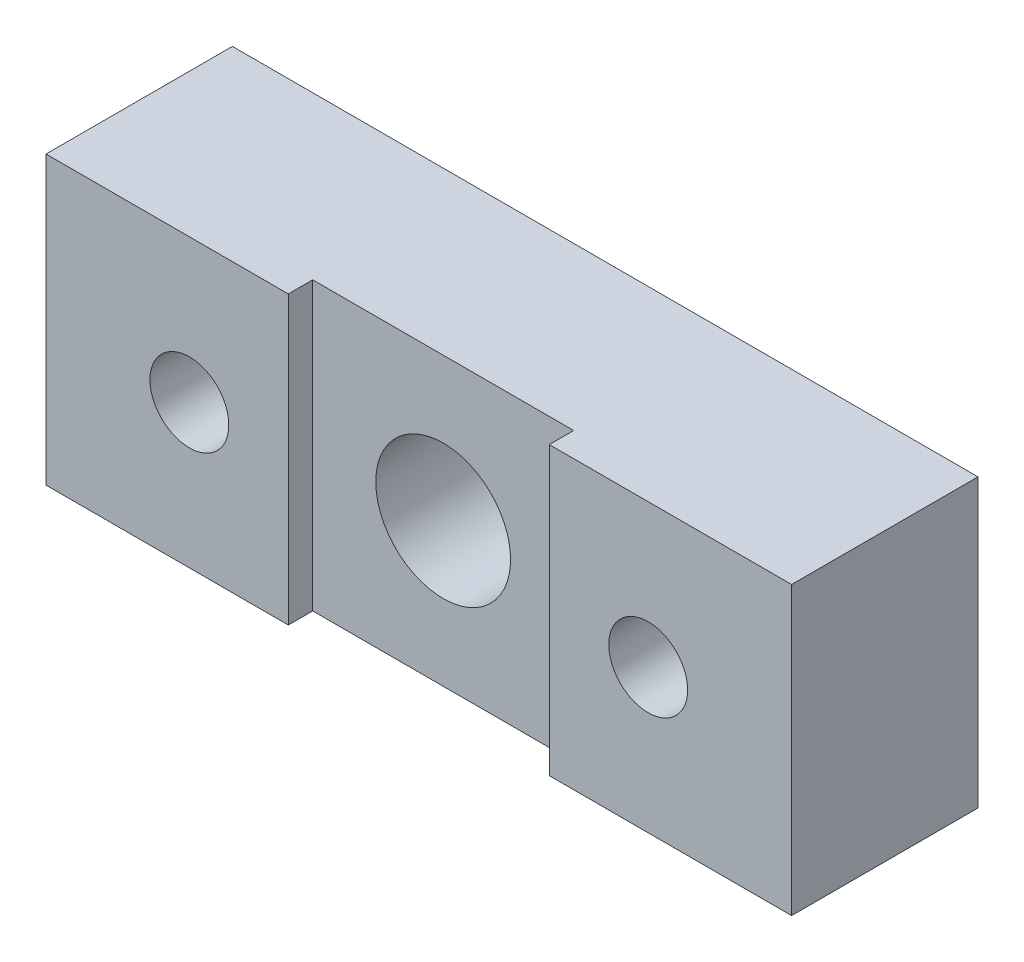
ISO-10303-21;
HEADER;
FILE_DESCRIPTION(('STEP AP214'),'2;1');
FILE_NAME('part.step','',(''),(''),'','','');
FILE_SCHEMA(('AUTOMOTIVE_DESIGN { 1 0 10303 214 1 1 1 1 }'));
ENDSEC;
DATA;
#1=APPLICATION_CONTEXT('core data for automotive mechanical design processes');
#2=APPLICATION_PROTOCOL_DEFINITION('international standard','automotive_design',2000,#1);
#3=PRODUCT_CONTEXT('',#1,'mechanical');
#4=PRODUCT('Part','Part','',(#3));
#5=PRODUCT_RELATED_PRODUCT_CATEGORY('part','',(#4));
#6=PRODUCT_DEFINITION_FORMATION('','',#4);
#7=PRODUCT_DEFINITION_CONTEXT('part definition',#1,'design');
#8=PRODUCT_DEFINITION('design','',#6,#7);
#9=PRODUCT_DEFINITION_SHAPE('','',#8);
#10=(LENGTH_UNIT() NAMED_UNIT(*) SI_UNIT(.MILLI.,.METRE.));
#11=(NAMED_UNIT(*) PLANE_ANGLE_UNIT() SI_UNIT($,.RADIAN.));
#12=(NAMED_UNIT(*) SI_UNIT($,.STERADIAN.) SOLID_ANGLE_UNIT());
#13=UNCERTAINTY_MEASURE_WITH_UNIT(LENGTH_MEASURE(1.E-05),#10,'distance_accuracy_value','');
#14=(GEOMETRIC_REPRESENTATION_CONTEXT(3) GLOBAL_UNCERTAINTY_ASSIGNED_CONTEXT((#13)) GLOBAL_UNIT_ASSIGNED_CONTEXT((#10,
#11,#12)) REPRESENTATION_CONTEXT('',''));
#15=CARTESIAN_POINT('',(0.,0.,0.));
#16=DIRECTION('',(0.,0.,1.));
#17=DIRECTION('',(1.,0.,0.));
#18=AXIS2_PLACEMENT_3D('',#15,#16,#17);
#19=CARTESIAN_POINT('',(0.,0.,13.));
#20=DIRECTION('',(0.,0.,1.));
#21=DIRECTION('',(1.,0.,0.));
#22=AXIS2_PLACEMENT_3D('',#19,#20,#21);
#23=PLANE('',#22);
#24=DIRECTION('',(0.,-1.,0.));
#25=VECTOR('',#24,1.);
#26=CARTESIAN_POINT('',(-9.1,-10.,13.));
#27=LINE('',#26,#25);
#28=CARTESIAN_POINT('',(-9.1,10.,13.));
#29=VERTEX_POINT('',#28);
#30=CARTESIAN_POINT('',(-9.1,-10.,13.));
#31=VERTEX_POINT('',#30);
#32=EDGE_CURVE('E232',#29,#31,#27,.T.);
#33=ORIENTED_EDGE('',*,*,#32,.F.);
#34=DIRECTION('',(-1.,0.,0.));
#35=VECTOR('',#34,1.);
#36=CARTESIAN_POINT('',(-26.,10.,13.));
#37=LINE('',#36,#35);
#38=CARTESIAN_POINT('',(-26.,10.,13.));
#39=VERTEX_POINT('',#38);
#40=EDGE_CURVE('E159',#29,#39,#37,.T.);
#41=ORIENTED_EDGE('',*,*,#40,.T.);
#42=DIRECTION('',(0.,-1.,0.));
#43=VECTOR('',#42,1.);
#44=CARTESIAN_POINT('',(-26.,10.,13.));
#45=LINE('',#44,#43);
#46=CARTESIAN_POINT('',(-26.,-10.,13.));
#47=VERTEX_POINT('',#46);
#48=EDGE_CURVE('E161',#39,#47,#45,.T.);
#49=ORIENTED_EDGE('',*,*,#48,.T.);
#50=DIRECTION('',(1.,0.,0.));
#51=VECTOR('',#50,1.);
#52=CARTESIAN_POINT('',(-26.,-10.,13.));
#53=LINE('',#52,#51);
#54=EDGE_CURVE('E163',#47,#31,#53,.T.);
#55=ORIENTED_EDGE('',*,*,#54,.T.);
#56=EDGE_LOOP('',(#33,#41,#49,#55));
#57=FACE_BOUND('',#56,.T.);
#58=CARTESIAN_POINT('',(-16.,0.,13.));
#59=DIRECTION('',(0.,0.,1.));
#60=DIRECTION('',(1.,0.,0.));
#61=AXIS2_PLACEMENT_3D('',#58,#59,#60);
#62=CIRCLE('',#61,2.75);
#63=CARTESIAN_POINT('',(-18.75,0.,13.));
#64=VERTEX_POINT('',#63);
#65=EDGE_CURVE('E153',#64,#64,#62,.T.);
#66=ORIENTED_EDGE('',*,*,#65,.F.);
#67=EDGE_LOOP('',(#66));
#68=FACE_BOUND('',#67,.T.);
#69=ADVANCED_FACE('F36',(#57,#68),#23,.T.);
#70=CARTESIAN_POINT('',(0.,0.,13.));
#71=DIRECTION('',(0.,0.,-1.));
#72=DIRECTION('',(-1.,0.,0.));
#73=AXIS2_PLACEMENT_3D('',#70,#71,#72);
#74=CYLINDRICAL_SURFACE('',#73,4.7);
#75=CARTESIAN_POINT('',(0.,0.,0.));
#76=DIRECTION('',(0.,0.,1.));
#77=DIRECTION('',(1.,0.,0.));
#78=AXIS2_PLACEMENT_3D('',#75,#76,#77);
#79=CIRCLE('',#78,4.7);
#80=CARTESIAN_POINT('',(-4.7,0.,0.));
#81=VERTEX_POINT('',#80);
#82=EDGE_CURVE('E145',#81,#81,#79,.T.);
#83=CARTESIAN_POINT('',(0.,0.,11.3));
#84=DIRECTION('',(0.,0.,1.));
#85=DIRECTION('',(1.,0.,0.));
#86=AXIS2_PLACEMENT_3D('',#83,#84,#85);
#87=CIRCLE('',#86,4.7);
#88=CARTESIAN_POINT('',(-4.7,0.,11.3));
#89=VERTEX_POINT('',#88);
#90=EDGE_CURVE('E141',#89,#89,#87,.T.);
#91=CARTESIAN_POINT('',(-4.7,0.,0.));
#92=CARTESIAN_POINT('',(-4.7,0.,0.117708333333333));
#93=CARTESIAN_POINT('',(-4.7,0.,0.235416666666666));
#94=CARTESIAN_POINT('',(-4.7,0.,0.470833333333333));
#95=CARTESIAN_POINT('',(-4.7,0.,0.588541666666667));
#96=CARTESIAN_POINT('',(-4.7,0.,0.823958333333333));
#97=CARTESIAN_POINT('',(-4.7,0.,0.941666666666667));
#98=CARTESIAN_POINT('',(-4.7,0.,1.17708333333333));
#99=CARTESIAN_POINT('',(-4.7,0.,1.29479166666667));
#100=CARTESIAN_POINT('',(-4.7,0.,1.53020833333333));
#101=CARTESIAN_POINT('',(-4.7,0.,1.64791666666667));
#102=CARTESIAN_POINT('',(-4.7,0.,1.88333333333333));
#103=CARTESIAN_POINT('',(-4.7,0.,2.00104166666667));
#104=CARTESIAN_POINT('',(-4.7,0.,2.23645833333333));
#105=CARTESIAN_POINT('',(-4.7,0.,2.35416666666667));
#106=CARTESIAN_POINT('',(-4.7,0.,2.58958333333333));
#107=CARTESIAN_POINT('',(-4.7,0.,2.70729166666667));
#108=CARTESIAN_POINT('',(-4.7,0.,2.94270833333333));
#109=CARTESIAN_POINT('',(-4.7,0.,3.06041666666667));
#110=CARTESIAN_POINT('',(-4.7,0.,3.29583333333333));
#111=CARTESIAN_POINT('',(-4.7,0.,3.41354166666667));
#112=CARTESIAN_POINT('',(-4.7,0.,3.64895833333333));
#113=CARTESIAN_POINT('',(-4.7,0.,3.76666666666667));
#114=CARTESIAN_POINT('',(-4.7,0.,4.00208333333333));
#115=CARTESIAN_POINT('',(-4.7,0.,4.11979166666667));
#116=CARTESIAN_POINT('',(-4.7,0.,4.35520833333333));
#117=CARTESIAN_POINT('',(-4.7,0.,4.47291666666667));
#118=CARTESIAN_POINT('',(-4.7,0.,4.70833333333333));
#119=CARTESIAN_POINT('',(-4.7,0.,4.82604166666667));
#120=CARTESIAN_POINT('',(-4.7,0.,5.06145833333333));
#121=CARTESIAN_POINT('',(-4.7,0.,5.17916666666667));
#122=CARTESIAN_POINT('',(-4.7,0.,5.41458333333333));
#123=CARTESIAN_POINT('',(-4.7,0.,5.53229166666667));
#124=CARTESIAN_POINT('',(-4.7,0.,5.76770833333333));
#125=CARTESIAN_POINT('',(-4.7,0.,5.88541666666667));
#126=CARTESIAN_POINT('',(-4.7,0.,6.12083333333333));
#127=CARTESIAN_POINT('',(-4.7,0.,6.23854166666667));
#128=CARTESIAN_POINT('',(-4.7,0.,6.47395833333333));
#129=CARTESIAN_POINT('',(-4.7,0.,6.59166666666667));
#130=CARTESIAN_POINT('',(-4.7,0.,6.82708333333333));
#131=CARTESIAN_POINT('',(-4.7,0.,6.94479166666667));
#132=CARTESIAN_POINT('',(-4.7,0.,7.18020833333333));
#133=CARTESIAN_POINT('',(-4.7,0.,7.29791666666667));
#134=CARTESIAN_POINT('',(-4.7,0.,7.53333333333333));
#135=CARTESIAN_POINT('',(-4.7,0.,7.65104166666667));
#136=CARTESIAN_POINT('',(-4.7,0.,7.88645833333333));
#137=CARTESIAN_POINT('',(-4.7,0.,8.00416666666667));
#138=CARTESIAN_POINT('',(-4.7,0.,8.23958333333333));
#139=CARTESIAN_POINT('',(-4.7,0.,8.35729166666667));
#140=CARTESIAN_POINT('',(-4.7,0.,8.59270833333333));
#141=CARTESIAN_POINT('',(-4.7,0.,8.71041666666667));
#142=CARTESIAN_POINT('',(-4.7,0.,8.94583333333333));
#143=CARTESIAN_POINT('',(-4.7,0.,9.06354166666667));
#144=CARTESIAN_POINT('',(-4.7,0.,9.29895833333333));
#145=CARTESIAN_POINT('',(-4.7,0.,9.41666666666667));
#146=CARTESIAN_POINT('',(-4.7,0.,9.65208333333333));
#147=CARTESIAN_POINT('',(-4.7,0.,9.76979166666667));
#148=CARTESIAN_POINT('',(-4.7,0.,10.0052083333333));
#149=CARTESIAN_POINT('',(-4.7,0.,10.1229166666667));
#150=CARTESIAN_POINT('',(-4.7,0.,10.3583333333333));
#151=CARTESIAN_POINT('',(-4.7,0.,10.4760416666667));
#152=CARTESIAN_POINT('',(-4.7,0.,10.7114583333333));
#153=CARTESIAN_POINT('',(-4.7,0.,10.8291666666667));
#154=CARTESIAN_POINT('',(-4.7,0.,11.0645833333333));
#155=CARTESIAN_POINT('',(-4.7,0.,11.1822916666667));
#156=CARTESIAN_POINT('',(-4.7,0.,11.3));
#157=B_SPLINE_CURVE_WITH_KNOTS('',3,(#91,#92,#93,#94,#95,#96,#97,#98,#99,#100,#101,#102,#103,
#104,#105,#106,#107,#108,#109,#110,#111,#112,#113,#114,#115,#116,#117,#118,#119,#120,#121,#122,
#123,#124,#125,#126,#127,#128,#129,#130,#131,#132,#133,#134,#135,#136,#137,#138,#139,#140,#141,
#142,#143,#144,#145,#146,#147,#148,#149,#150,#151,#152,#153,#154,#155,#156),.UNSPECIFIED.,.F.,
.F.,(4,2,2,2,2,2,2,2,2,2,2,2,2,2,2,2,2,2,2,2,2,2,2,2,2,2,2,2,2,2,2,2,4),(0.,0.353124999999999,
0.70625,1.059375,1.4125,1.765625,2.11875,2.471875,2.825,3.178125,3.53125,3.884375,4.2375,
4.590625,4.94375,5.296875,5.65,6.003125,6.35625,6.709375,7.0625,7.415625,7.76875,8.121875,8.475,
8.828125,9.18125,9.534375,9.8875,10.240625,10.59375,10.946875,11.3),.UNSPECIFIED.);
#158=EDGE_CURVE('BSEAM204',#81,#89,#157,.T.);
#159=ORIENTED_EDGE('',*,*,#82,.F.);
#160=ORIENTED_EDGE('',*,*,#90,.T.);
#161=ORIENTED_EDGE('',*,*,#158,.T.);
#162=ORIENTED_EDGE('',*,*,#158,.F.);
#163=EDGE_LOOP('',(#159,#161,#160,#162));
#164=FACE_BOUND('',#163,.T.);
#165=ADVANCED_FACE('F204',(#164),#74,.F.);
#166=CARTESIAN_POINT('',(-16.,0.,13.));
#167=DIRECTION('',(0.,0.,-1.));
#168=DIRECTION('',(-1.,0.,0.));
#169=AXIS2_PLACEMENT_3D('',#166,#167,#168);
#170=CYLINDRICAL_SURFACE('',#169,2.75);
#171=CARTESIAN_POINT('',(-16.,0.,6.));
#172=DIRECTION('',(0.,0.,-1.));
#173=DIRECTION('',(-1.,0.,0.));
#174=AXIS2_PLACEMENT_3D('',#171,#172,#173);
#175=CIRCLE('',#174,2.75);
#176=CARTESIAN_POINT('',(-18.75,0.,6.));
#177=VERTEX_POINT('',#176);
#178=EDGE_CURVE('E44',#177,#177,#175,.T.);
#179=CARTESIAN_POINT('',(-18.75,0.,6.));
#180=CARTESIAN_POINT('',(-18.75,0.,6.07291666666667));
#181=CARTESIAN_POINT('',(-18.75,0.,6.14583333333333));
#182=CARTESIAN_POINT('',(-18.75,0.,6.29166666666667));
#183=CARTESIAN_POINT('',(-18.75,0.,6.36458333333333));
#184=CARTESIAN_POINT('',(-18.75,0.,6.51041666666667));
#185=CARTESIAN_POINT('',(-18.75,0.,6.58333333333333));
#186=CARTESIAN_POINT('',(-18.75,0.,6.72916666666667));
#187=CARTESIAN_POINT('',(-18.75,0.,6.80208333333333));
#188=CARTESIAN_POINT('',(-18.75,0.,6.94791666666667));
#189=CARTESIAN_POINT('',(-18.75,0.,7.02083333333333));
#190=CARTESIAN_POINT('',(-18.75,0.,7.16666666666667));
#191=CARTESIAN_POINT('',(-18.75,0.,7.23958333333333));
#192=CARTESIAN_POINT('',(-18.75,0.,7.38541666666667));
#193=CARTESIAN_POINT('',(-18.75,0.,7.45833333333333));
#194=CARTESIAN_POINT('',(-18.75,0.,7.60416666666667));
#195=CARTESIAN_POINT('',(-18.75,0.,7.67708333333333));
#196=CARTESIAN_POINT('',(-18.75,0.,7.82291666666667));
#197=CARTESIAN_POINT('',(-18.75,0.,7.89583333333333));
#198=CARTESIAN_POINT('',(-18.75,0.,8.04166666666667));
#199=CARTESIAN_POINT('',(-18.75,0.,8.11458333333333));
#200=CARTESIAN_POINT('',(-18.75,0.,8.26041666666667));
#201=CARTESIAN_POINT('',(-18.75,0.,8.33333333333333));
#202=CARTESIAN_POINT('',(-18.75,0.,8.47916666666667));
#203=CARTESIAN_POINT('',(-18.75,0.,8.55208333333333));
#204=CARTESIAN_POINT('',(-18.75,0.,8.69791666666667));
#205=CARTESIAN_POINT('',(-18.75,0.,8.77083333333333));
#206=CARTESIAN_POINT('',(-18.75,0.,8.91666666666667));
#207=CARTESIAN_POINT('',(-18.75,0.,8.98958333333333));
#208=CARTESIAN_POINT('',(-18.75,0.,9.13541666666667));
#209=CARTESIAN_POINT('',(-18.75,0.,9.20833333333333));
#210=CARTESIAN_POINT('',(-18.75,0.,9.35416666666667));
#211=CARTESIAN_POINT('',(-18.75,0.,9.42708333333333));
#212=CARTESIAN_POINT('',(-18.75,0.,9.57291666666667));
#213=CARTESIAN_POINT('',(-18.75,0.,9.64583333333333));
#214=CARTESIAN_POINT('',(-18.75,0.,9.79166666666667));
#215=CARTESIAN_POINT('',(-18.75,0.,9.86458333333333));
#216=CARTESIAN_POINT('',(-18.75,0.,10.0104166666667));
#217=CARTESIAN_POINT('',(-18.75,0.,10.0833333333333));
#218=CARTESIAN_POINT('',(-18.75,0.,10.2291666666667));
#219=CARTESIAN_POINT('',(-18.75,0.,10.3020833333333));
#220=CARTESIAN_POINT('',(-18.75,0.,10.4479166666667));
#221=CARTESIAN_POINT('',(-18.75,0.,10.5208333333333));
#222=CARTESIAN_POINT('',(-18.75,0.,10.6666666666667));
#223=CARTESIAN_POINT('',(-18.75,0.,10.7395833333333));
#224=CARTESIAN_POINT('',(-18.75,0.,10.8854166666667));
#225=CARTESIAN_POINT('',(-18.75,0.,10.9583333333333));
#226=CARTESIAN_POINT('',(-18.75,0.,11.1041666666667));
#227=CARTESIAN_POINT('',(-18.75,0.,11.1770833333333));
#228=CARTESIAN_POINT('',(-18.75,0.,11.3229166666667));
#229=CARTESIAN_POINT('',(-18.75,0.,11.3958333333333));
#230=CARTESIAN_POINT('',(-18.75,0.,11.5416666666667));
#231=CARTESIAN_POINT('',(-18.75,0.,11.6145833333333));
#232=CARTESIAN_POINT('',(-18.75,0.,11.7604166666667));
#233=CARTESIAN_POINT('',(-18.75,0.,11.8333333333333));
#234=CARTESIAN_POINT('',(-18.75,0.,11.9791666666667));
#235=CARTESIAN_POINT('',(-18.75,0.,12.0520833333333));
#236=CARTESIAN_POINT('',(-18.75,0.,12.1979166666667));
#237=CARTESIAN_POINT('',(-18.75,0.,12.2708333333333));
#238=CARTESIAN_POINT('',(-18.75,0.,12.4166666666667));
#239=CARTESIAN_POINT('',(-18.75,0.,12.4895833333333));
#240=CARTESIAN_POINT('',(-18.75,0.,12.6354166666667));
#241=CARTESIAN_POINT('',(-18.75,0.,12.7083333333333));
#242=CARTESIAN_POINT('',(-18.75,0.,12.8541666666667));
#243=CARTESIAN_POINT('',(-18.75,0.,12.9270833333333));
#244=CARTESIAN_POINT('',(-18.75,0.,13.));
#245=B_SPLINE_CURVE_WITH_KNOTS('',3,(#179,#180,#181,#182,#183,#184,#185,#186,#187,#188,#189,
#190,#191,#192,#193,#194,#195,#196,#197,#198,#199,#200,#201,#202,#203,#204,#205,#206,#207,#208,
#209,#210,#211,#212,#213,#214,#215,#216,#217,#218,#219,#220,#221,#222,#223,#224,#225,#226,#227,
#228,#229,#230,#231,#232,#233,#234,#235,#236,#237,#238,#239,#240,#241,#242,#243,#244),
.UNSPECIFIED.,.F.,.F.,(4,2,2,2,2,2,2,2,2,2,2,2,2,2,2,2,2,2,2,2,2,2,2,2,2,2,2,2,2,2,2,2,4),(0.,
0.21875,0.4375,0.65625,0.875,1.09375,1.3125,1.53125,1.75,1.96875,2.1875,2.40625,2.625,2.84375,
3.0625,3.28125,3.5,3.71875,3.9375,4.15625,4.375,4.59375,4.8125,5.03125,5.25,5.46875,5.6875,
5.90625,6.125,6.34375,6.5625,6.78125,7.),.UNSPECIFIED.);
#246=EDGE_CURVE('BSEAM192',#177,#64,#245,.T.);
#247=ORIENTED_EDGE('',*,*,#178,.T.);
#248=ORIENTED_EDGE('',*,*,#65,.T.);
#249=ORIENTED_EDGE('',*,*,#246,.T.);
#250=ORIENTED_EDGE('',*,*,#246,.F.);
#251=EDGE_LOOP('',(#247,#249,#248,#250));
#252=FACE_BOUND('',#251,.T.);
#253=ADVANCED_FACE('F192',(#252),#170,.F.);
#254=CARTESIAN_POINT('',(16.,0.,13.));
#255=DIRECTION('',(0.,0.,-1.));
#256=DIRECTION('',(-1.,0.,0.));
#257=AXIS2_PLACEMENT_3D('',#254,#255,#256);
#258=CYLINDRICAL_SURFACE('',#257,2.75);
#259=CARTESIAN_POINT('',(16.,0.,6.));
#260=DIRECTION('',(0.,0.,-1.));
#261=DIRECTION('',(-1.,0.,0.));
#262=AXIS2_PLACEMENT_3D('',#259,#260,#261);
#263=CIRCLE('',#262,2.75);
#264=CARTESIAN_POINT('',(13.25,0.,6.));
#265=VERTEX_POINT('',#264);
#266=EDGE_CURVE('E182',#265,#265,#263,.T.);
#267=CARTESIAN_POINT('',(16.,0.,13.));
#268=DIRECTION('',(0.,0.,1.));
#269=DIRECTION('',(1.,0.,0.));
#270=AXIS2_PLACEMENT_3D('',#267,#268,#269);
#271=CIRCLE('',#270,2.75);
#272=CARTESIAN_POINT('',(13.25,0.,13.));
#273=VERTEX_POINT('',#272);
#274=EDGE_CURVE('E150',#273,#273,#271,.T.);
#275=CARTESIAN_POINT('',(13.25,0.,6.));
#276=CARTESIAN_POINT('',(13.25,0.,6.07291666666667));
#277=CARTESIAN_POINT('',(13.25,0.,6.14583333333333));
#278=CARTESIAN_POINT('',(13.25,0.,6.29166666666667));
#279=CARTESIAN_POINT('',(13.25,0.,6.36458333333333));
#280=CARTESIAN_POINT('',(13.25,0.,6.51041666666667));
#281=CARTESIAN_POINT('',(13.25,0.,6.58333333333333));
#282=CARTESIAN_POINT('',(13.25,0.,6.72916666666667));
#283=CARTESIAN_POINT('',(13.25,0.,6.80208333333333));
#284=CARTESIAN_POINT('',(13.25,0.,6.94791666666667));
#285=CARTESIAN_POINT('',(13.25,0.,7.02083333333333));
#286=CARTESIAN_POINT('',(13.25,0.,7.16666666666667));
#287=CARTESIAN_POINT('',(13.25,0.,7.23958333333333));
#288=CARTESIAN_POINT('',(13.25,0.,7.38541666666667));
#289=CARTESIAN_POINT('',(13.25,0.,7.45833333333333));
#290=CARTESIAN_POINT('',(13.25,0.,7.60416666666667));
#291=CARTESIAN_POINT('',(13.25,0.,7.67708333333333));
#292=CARTESIAN_POINT('',(13.25,0.,7.82291666666667));
#293=CARTESIAN_POINT('',(13.25,0.,7.89583333333333));
#294=CARTESIAN_POINT('',(13.25,0.,8.04166666666667));
#295=CARTESIAN_POINT('',(13.25,0.,8.11458333333333));
#296=CARTESIAN_POINT('',(13.25,0.,8.26041666666667));
#297=CARTESIAN_POINT('',(13.25,0.,8.33333333333333));
#298=CARTESIAN_POINT('',(13.25,0.,8.47916666666667));
#299=CARTESIAN_POINT('',(13.25,0.,8.55208333333333));
#300=CARTESIAN_POINT('',(13.25,0.,8.69791666666667));
#301=CARTESIAN_POINT('',(13.25,0.,8.77083333333333));
#302=CARTESIAN_POINT('',(13.25,0.,8.91666666666667));
#303=CARTESIAN_POINT('',(13.25,0.,8.98958333333333));
#304=CARTESIAN_POINT('',(13.25,0.,9.13541666666667));
#305=CARTESIAN_POINT('',(13.25,0.,9.20833333333333));
#306=CARTESIAN_POINT('',(13.25,0.,9.35416666666667));
#307=CARTESIAN_POINT('',(13.25,0.,9.42708333333333));
#308=CARTESIAN_POINT('',(13.25,0.,9.57291666666667));
#309=CARTESIAN_POINT('',(13.25,0.,9.64583333333333));
#310=CARTESIAN_POINT('',(13.25,0.,9.79166666666667));
#311=CARTESIAN_POINT('',(13.25,0.,9.86458333333333));
#312=CARTESIAN_POINT('',(13.25,0.,10.0104166666667));
#313=CARTESIAN_POINT('',(13.25,0.,10.0833333333333));
#314=CARTESIAN_POINT('',(13.25,0.,10.2291666666667));
#315=CARTESIAN_POINT('',(13.25,0.,10.3020833333333));
#316=CARTESIAN_POINT('',(13.25,0.,10.4479166666667));
#317=CARTESIAN_POINT('',(13.25,0.,10.5208333333333));
#318=CARTESIAN_POINT('',(13.25,0.,10.6666666666667));
#319=CARTESIAN_POINT('',(13.25,0.,10.7395833333333));
#320=CARTESIAN_POINT('',(13.25,0.,10.8854166666667));
#321=CARTESIAN_POINT('',(13.25,0.,10.9583333333333));
#322=CARTESIAN_POINT('',(13.25,0.,11.1041666666667));
#323=CARTESIAN_POINT('',(13.25,0.,11.1770833333333));
#324=CARTESIAN_POINT('',(13.25,0.,11.3229166666667));
#325=CARTESIAN_POINT('',(13.25,0.,11.3958333333333));
#326=CARTESIAN_POINT('',(13.25,0.,11.5416666666667));
#327=CARTESIAN_POINT('',(13.25,0.,11.6145833333333));
#328=CARTESIAN_POINT('',(13.25,0.,11.7604166666667));
#329=CARTESIAN_POINT('',(13.25,0.,11.8333333333333));
#330=CARTESIAN_POINT('',(13.25,0.,11.9791666666667));
#331=CARTESIAN_POINT('',(13.25,0.,12.0520833333333));
#332=CARTESIAN_POINT('',(13.25,0.,12.1979166666667));
#333=CARTESIAN_POINT('',(13.25,0.,12.2708333333333));
#334=CARTESIAN_POINT('',(13.25,0.,12.4166666666667));
#335=CARTESIAN_POINT('',(13.25,0.,12.4895833333333));
#336=CARTESIAN_POINT('',(13.25,0.,12.6354166666667));
#337=CARTESIAN_POINT('',(13.25,0.,12.7083333333333));
#338=CARTESIAN_POINT('',(13.25,0.,12.8541666666667));
#339=CARTESIAN_POINT('',(13.25,0.,12.9270833333333));
#340=CARTESIAN_POINT('',(13.25,0.,13.));
#341=B_SPLINE_CURVE_WITH_KNOTS('',3,(#275,#276,#277,#278,#279,#280,#281,#282,#283,#284,#285,
#286,#287,#288,#289,#290,#291,#292,#293,#294,#295,#296,#297,#298,#299,#300,#301,#302,#303,#304,
#305,#306,#307,#308,#309,#310,#311,#312,#313,#314,#315,#316,#317,#318,#319,#320,#321,#322,#323,
#324,#325,#326,#327,#328,#329,#330,#331,#332,#333,#334,#335,#336,#337,#338,#339,#340),
.UNSPECIFIED.,.F.,.F.,(4,2,2,2,2,2,2,2,2,2,2,2,2,2,2,2,2,2,2,2,2,2,2,2,2,2,2,2,2,2,2,2,4),(0.,
0.21875,0.4375,0.65625,0.875,1.09375,1.3125,1.53125,1.75,1.96875,2.1875,2.40625,2.625,2.84375,
3.0625,3.28125,3.5,3.71875,3.9375,4.15625,4.375,4.59375,4.8125,5.03125,5.25,5.46875,5.6875,
5.90625,6.125,6.34375,6.5625,6.78125,7.),.UNSPECIFIED.);
#342=EDGE_CURVE('BSEAM219',#265,#273,#341,.T.);
#343=ORIENTED_EDGE('',*,*,#266,.T.);
#344=ORIENTED_EDGE('',*,*,#274,.T.);
#345=ORIENTED_EDGE('',*,*,#342,.T.);
#346=ORIENTED_EDGE('',*,*,#342,.F.);
#347=EDGE_LOOP('',(#343,#345,#344,#346));
#348=FACE_BOUND('',#347,.T.);
#349=ADVANCED_FACE('F219',(#348),#258,.F.);
#350=DIRECTION('',(0.,1.,0.));
#351=VECTOR('',#350,1.);
#352=CARTESIAN_POINT('',(9.1,-10.,13.));
#353=LINE('',#352,#351);
#354=CARTESIAN_POINT('',(9.1,-10.,13.));
#355=VERTEX_POINT('',#354);
#356=CARTESIAN_POINT('',(9.1,10.,13.));
#357=VERTEX_POINT('',#356);
#358=EDGE_CURVE('E229',#355,#357,#353,.T.);
#359=ORIENTED_EDGE('',*,*,#358,.F.);
#360=CARTESIAN_POINT('',(26.,-10.,13.));
#361=VERTEX_POINT('',#360);
#362=EDGE_CURVE('E60',#355,#361,#53,.T.);
#363=ORIENTED_EDGE('',*,*,#362,.T.);
#364=DIRECTION('',(0.,1.,0.));
#365=VECTOR('',#364,1.);
#366=CARTESIAN_POINT('',(26.,10.,13.));
#367=LINE('',#366,#365);
#368=CARTESIAN_POINT('',(26.,10.,13.));
#369=VERTEX_POINT('',#368);
#370=EDGE_CURVE('E157',#361,#369,#367,.T.);
#371=ORIENTED_EDGE('',*,*,#370,.T.);
#372=EDGE_CURVE('E90',#369,#357,#37,.T.);
#373=ORIENTED_EDGE('',*,*,#372,.T.);
#374=EDGE_LOOP('',(#359,#363,#371,#373));
#375=FACE_BOUND('',#374,.T.);
#376=ORIENTED_EDGE('',*,*,#274,.F.);
#377=EDGE_LOOP('',(#376));
#378=FACE_BOUND('',#377,.T.);
#379=ADVANCED_FACE('F207',(#375,#378),#23,.T.);
#380=CARTESIAN_POINT('',(0.,0.,0.));
#381=DIRECTION('',(0.,0.,1.));
#382=DIRECTION('',(1.,0.,0.));
#383=AXIS2_PLACEMENT_3D('',#380,#381,#382);
#384=PLANE('',#383);
#385=CARTESIAN_POINT('',(-16.,0.,0.));
#386=DIRECTION('',(0.,0.,-1.));
#387=DIRECTION('',(-1.,0.,0.));
#388=AXIS2_PLACEMENT_3D('',#385,#386,#387);
#389=CIRCLE('',#388,4.5);
#390=CARTESIAN_POINT('',(-20.5,0.,0.));
#391=VERTEX_POINT('',#390);
#392=EDGE_CURVE('E138',#391,#391,#389,.T.);
#393=ORIENTED_EDGE('',*,*,#392,.F.);
#394=EDGE_LOOP('',(#393));
#395=FACE_BOUND('',#394,.T.);
#396=CARTESIAN_POINT('',(16.,0.,0.));
#397=DIRECTION('',(0.,0.,-1.));
#398=DIRECTION('',(-1.,0.,0.));
#399=AXIS2_PLACEMENT_3D('',#396,#397,#398);
#400=CIRCLE('',#399,4.5);
#401=CARTESIAN_POINT('',(11.5,0.,0.));
#402=VERTEX_POINT('',#401);
#403=EDGE_CURVE('E137',#402,#402,#400,.T.);
#404=ORIENTED_EDGE('',*,*,#403,.F.);
#405=EDGE_LOOP('',(#404));
#406=FACE_BOUND('',#405,.T.);
#407=DIRECTION('',(0.,1.,0.));
#408=VECTOR('',#407,1.);
#409=CARTESIAN_POINT('',(26.,10.,0.));
#410=LINE('',#409,#408);
#411=CARTESIAN_POINT('',(26.,-10.,0.));
#412=VERTEX_POINT('',#411);
#413=CARTESIAN_POINT('',(26.,10.,0.));
#414=VERTEX_POINT('',#413);
#415=EDGE_CURVE('E156',#412,#414,#410,.T.);
#416=ORIENTED_EDGE('',*,*,#415,.F.);
#417=DIRECTION('',(1.,0.,0.));
#418=VECTOR('',#417,1.);
#419=CARTESIAN_POINT('',(-26.,-10.,0.));
#420=LINE('',#419,#418);
#421=CARTESIAN_POINT('',(-26.,-10.,0.));
#422=VERTEX_POINT('',#421);
#423=EDGE_CURVE('E82',#422,#412,#420,.T.);
#424=ORIENTED_EDGE('',*,*,#423,.F.);
#425=DIRECTION('',(0.,-1.,0.));
#426=VECTOR('',#425,1.);
#427=CARTESIAN_POINT('',(-26.,10.,0.));
#428=LINE('',#427,#426);
#429=CARTESIAN_POINT('',(-26.,10.,0.));
#430=VERTEX_POINT('',#429);
#431=EDGE_CURVE('E171',#430,#422,#428,.T.);
#432=ORIENTED_EDGE('',*,*,#431,.F.);
#433=DIRECTION('',(-1.,0.,0.));
#434=VECTOR('',#433,1.);
#435=CARTESIAN_POINT('',(-26.,10.,0.));
#436=LINE('',#435,#434);
#437=EDGE_CURVE('E169',#414,#430,#436,.T.);
#438=ORIENTED_EDGE('',*,*,#437,.F.);
#439=EDGE_LOOP('',(#416,#424,#432,#438));
#440=FACE_BOUND('',#439,.T.);
#441=ORIENTED_EDGE('',*,*,#82,.T.);
#442=EDGE_LOOP('',(#441));
#443=FACE_BOUND('',#442,.T.);
#444=ADVANCED_FACE('F218',(#395,#406,#440,#443),#384,.F.);
#445=CARTESIAN_POINT('',(26.,10.,13.));
#446=DIRECTION('',(-1.,0.,0.));
#447=DIRECTION('',(0.,-1.,0.));
#448=AXIS2_PLACEMENT_3D('',#445,#446,#447);
#449=PLANE('',#448);
#450=ORIENTED_EDGE('',*,*,#415,.T.);
#451=DIRECTION('',(0.,0.,-1.));
#452=VECTOR('',#451,1.);
#453=CARTESIAN_POINT('',(26.,10.,13.));
#454=LINE('',#453,#452);
#455=EDGE_CURVE('E180',#369,#414,#454,.T.);
#456=ORIENTED_EDGE('',*,*,#455,.F.);
#457=ORIENTED_EDGE('',*,*,#370,.F.);
#458=DIRECTION('',(0.,0.,-1.));
#459=VECTOR('',#458,1.);
#460=CARTESIAN_POINT('',(26.,-10.,13.));
#461=LINE('',#460,#459);
#462=EDGE_CURVE('E166',#361,#412,#461,.T.);
#463=ORIENTED_EDGE('',*,*,#462,.T.);
#464=EDGE_LOOP('',(#450,#456,#457,#463));
#465=FACE_BOUND('',#464,.T.);
#466=ADVANCED_FACE('F224',(#465),#449,.F.);
#467=CARTESIAN_POINT('',(-26.,10.,13.));
#468=DIRECTION('',(0.,-1.,0.));
#469=DIRECTION('',(0.,0.,-1.));
#470=AXIS2_PLACEMENT_3D('',#467,#468,#469);
#471=PLANE('',#470);
#472=ORIENTED_EDGE('',*,*,#40,.F.);
#473=DIRECTION('',(0.,0.,1.));
#474=VECTOR('',#473,1.);
#475=CARTESIAN_POINT('',(-9.1,10.,11.3));
#476=LINE('',#475,#474);
#477=CARTESIAN_POINT('',(-9.1,10.,11.3));
#478=VERTEX_POINT('',#477);
#479=EDGE_CURVE('E129',#478,#29,#476,.T.);
#480=ORIENTED_EDGE('',*,*,#479,.F.);
#481=DIRECTION('',(-1.,0.,0.));
#482=VECTOR('',#481,1.);
#483=CARTESIAN_POINT('',(9.1,10.,11.3));
#484=LINE('',#483,#482);
#485=CARTESIAN_POINT('',(9.1,10.,11.3));
#486=VERTEX_POINT('',#485);
#487=EDGE_CURVE('E119',#486,#478,#484,.T.);
#488=ORIENTED_EDGE('',*,*,#487,.F.);
#489=DIRECTION('',(0.,0.,1.));
#490=VECTOR('',#489,1.);
#491=CARTESIAN_POINT('',(9.1,10.,11.3));
#492=LINE('',#491,#490);
#493=EDGE_CURVE('E117',#486,#357,#492,.T.);
#494=ORIENTED_EDGE('',*,*,#493,.T.);
#495=ORIENTED_EDGE('',*,*,#372,.F.);
#496=ORIENTED_EDGE('',*,*,#455,.T.);
#497=ORIENTED_EDGE('',*,*,#437,.T.);
#498=DIRECTION('',(0.,0.,-1.));
#499=VECTOR('',#498,1.);
#500=CARTESIAN_POINT('',(-26.,10.,13.));
#501=LINE('',#500,#499);
#502=EDGE_CURVE('E177',#39,#430,#501,.T.);
#503=ORIENTED_EDGE('',*,*,#502,.F.);
#504=EDGE_LOOP('',(#472,#480,#488,#494,#495,#496,#497,#503));
#505=FACE_BOUND('',#504,.T.);
#506=ADVANCED_FACE('F243',(#505),#471,.F.);
#507=CARTESIAN_POINT('',(-26.,10.,13.));
#508=DIRECTION('',(1.,0.,0.));
#509=DIRECTION('',(0.,0.,-1.));
#510=AXIS2_PLACEMENT_3D('',#507,#508,#509);
#511=PLANE('',#510);
#512=ORIENTED_EDGE('',*,*,#431,.T.);
#513=DIRECTION('',(0.,0.,-1.));
#514=VECTOR('',#513,1.);
#515=CARTESIAN_POINT('',(-26.,-10.,13.));
#516=LINE('',#515,#514);
#517=EDGE_CURVE('E175',#47,#422,#516,.T.);
#518=ORIENTED_EDGE('',*,*,#517,.F.);
#519=ORIENTED_EDGE('',*,*,#48,.F.);
#520=ORIENTED_EDGE('',*,*,#502,.T.);
#521=EDGE_LOOP('',(#512,#518,#519,#520));
#522=FACE_BOUND('',#521,.T.);
#523=ADVANCED_FACE('F248',(#522),#511,.F.);
#524=CARTESIAN_POINT('',(-26.,-10.,13.));
#525=DIRECTION('',(0.,1.,0.));
#526=DIRECTION('',(0.,0.,1.));
#527=AXIS2_PLACEMENT_3D('',#524,#525,#526);
#528=PLANE('',#527);
#529=DIRECTION('',(1.,0.,0.));
#530=VECTOR('',#529,1.);
#531=CARTESIAN_POINT('',(9.1,-10.,11.3));
#532=LINE('',#531,#530);
#533=CARTESIAN_POINT('',(-9.1,-10.,11.3));
#534=VERTEX_POINT('',#533);
#535=CARTESIAN_POINT('',(9.1,-10.,11.3));
#536=VERTEX_POINT('',#535);
#537=EDGE_CURVE('E120',#534,#536,#532,.T.);
#538=ORIENTED_EDGE('',*,*,#537,.F.);
#539=DIRECTION('',(0.,0.,1.));
#540=VECTOR('',#539,1.);
#541=CARTESIAN_POINT('',(-9.1,-10.,11.3));
#542=LINE('',#541,#540);
#543=EDGE_CURVE('E127',#534,#31,#542,.T.);
#544=ORIENTED_EDGE('',*,*,#543,.T.);
#545=ORIENTED_EDGE('',*,*,#54,.F.);
#546=ORIENTED_EDGE('',*,*,#517,.T.);
#547=ORIENTED_EDGE('',*,*,#423,.T.);
#548=ORIENTED_EDGE('',*,*,#462,.F.);
#549=ORIENTED_EDGE('',*,*,#362,.F.);
#550=DIRECTION('',(0.,0.,1.));
#551=VECTOR('',#550,1.);
#552=CARTESIAN_POINT('',(9.1,-10.,11.3));
#553=LINE('',#552,#551);
#554=EDGE_CURVE('E116',#536,#355,#553,.T.);
#555=ORIENTED_EDGE('',*,*,#554,.F.);
#556=EDGE_LOOP('',(#538,#544,#545,#546,#547,#548,#549,#555));
#557=FACE_BOUND('',#556,.T.);
#558=ADVANCED_FACE('F126',(#557),#528,.F.);
#559=CARTESIAN_POINT('',(16.,0.,5.));
#560=DIRECTION('',(0.,0.,-1.));
#561=DIRECTION('',(-1.,0.,0.));
#562=AXIS2_PLACEMENT_3D('',#559,#560,#561);
#563=CYLINDRICAL_SURFACE('',#562,4.5);
#564=CARTESIAN_POINT('',(16.,0.,5.));
#565=DIRECTION('',(0.,0.,-1.));
#566=DIRECTION('',(-1.,0.,0.));
#567=AXIS2_PLACEMENT_3D('',#564,#565,#566);
#568=CIRCLE('',#567,4.5);
#569=CARTESIAN_POINT('',(11.5,0.,5.));
#570=VERTEX_POINT('',#569);
#571=EDGE_CURVE('E142',#570,#570,#568,.T.);
#572=ORIENTED_EDGE('',*,*,#571,.F.);
#573=EDGE_LOOP('',(#572));
#574=FACE_BOUND('',#573,.T.);
#575=ORIENTED_EDGE('',*,*,#403,.T.);
#576=EDGE_LOOP('',(#575));
#577=FACE_BOUND('',#576,.T.);
#578=ADVANCED_FACE('F265',(#574,#577),#563,.F.);
#579=CARTESIAN_POINT('',(16.,0.,5.));
#580=DIRECTION('',(0.,0.,-1.));
#581=DIRECTION('',(-1.,0.,0.));
#582=AXIS2_PLACEMENT_3D('',#579,#580,#581);
#583=PLANE('',#582);
#584=CARTESIAN_POINT('',(16.,0.,5.));
#585=DIRECTION('',(0.,0.,-1.));
#586=DIRECTION('',(-1.,0.,0.));
#587=AXIS2_PLACEMENT_3D('',#584,#585,#586);
#588=CIRCLE('',#587,3.75);
#589=CARTESIAN_POINT('',(12.25,0.,5.));
#590=VERTEX_POINT('',#589);
#591=EDGE_CURVE('E187',#590,#590,#588,.F.);
#592=ORIENTED_EDGE('',*,*,#591,.T.);
#593=EDGE_LOOP('',(#592));
#594=FACE_BOUND('',#593,.T.);
#595=ORIENTED_EDGE('',*,*,#571,.T.);
#596=EDGE_LOOP('',(#595));
#597=FACE_BOUND('',#596,.T.);
#598=ADVANCED_FACE('F269',(#594,#597),#583,.T.);
#599=CARTESIAN_POINT('',(-16.,0.,5.));
#600=DIRECTION('',(0.,0.,-1.));
#601=DIRECTION('',(-1.,0.,0.));
#602=AXIS2_PLACEMENT_3D('',#599,#600,#601);
#603=CYLINDRICAL_SURFACE('',#602,4.5);
#604=CARTESIAN_POINT('',(-16.,0.,5.));
#605=DIRECTION('',(0.,0.,-1.));
#606=DIRECTION('',(-1.,0.,0.));
#607=AXIS2_PLACEMENT_3D('',#604,#605,#606);
#608=CIRCLE('',#607,4.5);
#609=CARTESIAN_POINT('',(-20.5,0.,5.));
#610=VERTEX_POINT('',#609);
#611=EDGE_CURVE('E134',#610,#610,#608,.T.);
#612=ORIENTED_EDGE('',*,*,#611,.F.);
#613=EDGE_LOOP('',(#612));
#614=FACE_BOUND('',#613,.T.);
#615=ORIENTED_EDGE('',*,*,#392,.T.);
#616=EDGE_LOOP('',(#615));
#617=FACE_BOUND('',#616,.T.);
#618=ADVANCED_FACE('F275',(#614,#617),#603,.F.);
#619=CARTESIAN_POINT('',(-16.,0.,5.));
#620=DIRECTION('',(0.,0.,-1.));
#621=DIRECTION('',(-1.,0.,0.));
#622=AXIS2_PLACEMENT_3D('',#619,#620,#621);
#623=PLANE('',#622);
#624=CARTESIAN_POINT('',(-16.,0.,5.));
#625=DIRECTION('',(0.,0.,-1.));
#626=DIRECTION('',(-1.,0.,0.));
#627=AXIS2_PLACEMENT_3D('',#624,#625,#626);
#628=CIRCLE('',#627,3.75);
#629=CARTESIAN_POINT('',(-19.75,0.,5.));
#630=VERTEX_POINT('',#629);
#631=EDGE_CURVE('E11',#630,#630,#628,.F.);
#632=ORIENTED_EDGE('',*,*,#631,.T.);
#633=EDGE_LOOP('',(#632));
#634=FACE_BOUND('',#633,.T.);
#635=ORIENTED_EDGE('',*,*,#611,.T.);
#636=EDGE_LOOP('',(#635));
#637=FACE_BOUND('',#636,.T.);
#638=ADVANCED_FACE('F306',(#634,#637),#623,.T.);
#639=CARTESIAN_POINT('',(-9.1,-10.,11.3));
#640=DIRECTION('',(-1.,0.,0.));
#641=DIRECTION('',(0.,0.,1.));
#642=AXIS2_PLACEMENT_3D('',#639,#640,#641);
#643=PLANE('',#642);
#644=ORIENTED_EDGE('',*,*,#32,.T.);
#645=ORIENTED_EDGE('',*,*,#543,.F.);
#646=DIRECTION('',(0.,-1.,0.));
#647=VECTOR('',#646,1.);
#648=CARTESIAN_POINT('',(-9.1,-10.,11.3));
#649=LINE('',#648,#647);
#650=EDGE_CURVE('E51',#478,#534,#649,.T.);
#651=ORIENTED_EDGE('',*,*,#650,.F.);
#652=ORIENTED_EDGE('',*,*,#479,.T.);
#653=EDGE_LOOP('',(#644,#645,#651,#652));
#654=FACE_BOUND('',#653,.T.);
#655=ADVANCED_FACE('F239',(#654),#643,.F.);
#656=CARTESIAN_POINT('',(9.1,-10.,11.3));
#657=DIRECTION('',(1.,0.,0.));
#658=DIRECTION('',(0.,0.,-1.));
#659=AXIS2_PLACEMENT_3D('',#656,#657,#658);
#660=PLANE('',#659);
#661=ORIENTED_EDGE('',*,*,#358,.T.);
#662=ORIENTED_EDGE('',*,*,#493,.F.);
#663=DIRECTION('',(0.,1.,0.));
#664=VECTOR('',#663,1.);
#665=CARTESIAN_POINT('',(9.1,-10.,11.3));
#666=LINE('',#665,#664);
#667=EDGE_CURVE('E113',#536,#486,#666,.T.);
#668=ORIENTED_EDGE('',*,*,#667,.F.);
#669=ORIENTED_EDGE('',*,*,#554,.T.);
#670=EDGE_LOOP('',(#661,#662,#668,#669));
#671=FACE_BOUND('',#670,.T.);
#672=ADVANCED_FACE('F114',(#671),#660,.F.);
#673=CARTESIAN_POINT('',(0.,0.,11.3));
#674=DIRECTION('',(0.,0.,1.));
#675=DIRECTION('',(1.,0.,0.));
#676=AXIS2_PLACEMENT_3D('',#673,#674,#675);
#677=PLANE('',#676);
#678=ORIENTED_EDGE('',*,*,#90,.F.);
#679=EDGE_LOOP('',(#678));
#680=FACE_BOUND('',#679,.T.);
#681=ORIENTED_EDGE('',*,*,#650,.T.);
#682=ORIENTED_EDGE('',*,*,#537,.T.);
#683=ORIENTED_EDGE('',*,*,#667,.T.);
#684=ORIENTED_EDGE('',*,*,#487,.T.);
#685=EDGE_LOOP('',(#681,#682,#683,#684));
#686=FACE_BOUND('',#685,.T.);
#687=ADVANCED_FACE('F123',(#680,#686),#677,.T.);
#688=CARTESIAN_POINT('',(16.,0.,6.));
#689=DIRECTION('',(0.,0.,-1.));
#690=DIRECTION('',(-1.,0.,0.));
#691=AXIS2_PLACEMENT_3D('',#688,#689,#690);
#692=TOROIDAL_SURFACE('',#691,3.75,1.);
#693=ORIENTED_EDGE('',*,*,#591,.F.);
#694=EDGE_LOOP('',(#693));
#695=FACE_BOUND('',#694,.T.);
#696=ORIENTED_EDGE('',*,*,#266,.F.);
#697=EDGE_LOOP('',(#696));
#698=FACE_BOUND('',#697,.T.);
#699=ADVANCED_FACE('F196',(#695,#698),#692,.T.);
#700=CARTESIAN_POINT('',(-16.,0.,6.));
#701=DIRECTION('',(0.,0.,-1.));
#702=DIRECTION('',(-1.,0.,0.));
#703=AXIS2_PLACEMENT_3D('',#700,#701,#702);
#704=TOROIDAL_SURFACE('',#703,3.75,1.);
#705=ORIENTED_EDGE('',*,*,#631,.F.);
#706=EDGE_LOOP('',(#705));
#707=FACE_BOUND('',#706,.T.);
#708=ORIENTED_EDGE('',*,*,#178,.F.);
#709=EDGE_LOOP('',(#708));
#710=FACE_BOUND('',#709,.T.);
#711=ADVANCED_FACE('F38',(#707,#710),#704,.T.);
#712=CLOSED_SHELL('',(#69,#165,#253,#349,#379,#444,#466,#506,#523,#558,#578,#598,#618,#638,#655,
#672,#687,#699,#711));
#713=MANIFOLD_SOLID_BREP('B2',#712);
#714=ADVANCED_BREP_SHAPE_REPRESENTATION('',(#18,#713),#14);
#715=SHAPE_DEFINITION_REPRESENTATION(#9,#714);
ENDSEC;
END-ISO-10303-21;
